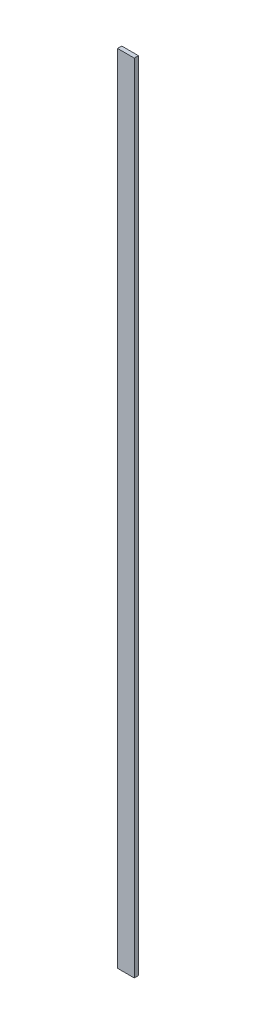
ISO-10303-21;
HEADER;
FILE_DESCRIPTION(('STEP AP214'),'2;1');
FILE_NAME('part.step','',(''),(''),'','','');
FILE_SCHEMA(('AUTOMOTIVE_DESIGN { 1 0 10303 214 1 1 1 1 }'));
ENDSEC;
DATA;
#1=APPLICATION_CONTEXT('core data for automotive mechanical design processes');
#2=APPLICATION_PROTOCOL_DEFINITION('international standard','automotive_design',2000,#1);
#3=PRODUCT_CONTEXT('',#1,'mechanical');
#4=PRODUCT('Part','Part','',(#3));
#5=PRODUCT_RELATED_PRODUCT_CATEGORY('part','',(#4));
#6=PRODUCT_DEFINITION_FORMATION('','',#4);
#7=PRODUCT_DEFINITION_CONTEXT('part definition',#1,'design');
#8=PRODUCT_DEFINITION('design','',#6,#7);
#9=PRODUCT_DEFINITION_SHAPE('','',#8);
#10=(LENGTH_UNIT() NAMED_UNIT(*) SI_UNIT(.MILLI.,.METRE.));
#11=(NAMED_UNIT(*) PLANE_ANGLE_UNIT() SI_UNIT($,.RADIAN.));
#12=(NAMED_UNIT(*) SI_UNIT($,.STERADIAN.) SOLID_ANGLE_UNIT());
#13=UNCERTAINTY_MEASURE_WITH_UNIT(LENGTH_MEASURE(1.E-05),#10,'distance_accuracy_value','');
#14=(GEOMETRIC_REPRESENTATION_CONTEXT(3) GLOBAL_UNCERTAINTY_ASSIGNED_CONTEXT((#13)) GLOBAL_UNIT_ASSIGNED_CONTEXT((#10,
#11,#12)) REPRESENTATION_CONTEXT('',''));
#15=CARTESIAN_POINT('',(0.,0.,0.));
#16=DIRECTION('',(0.,0.,1.));
#17=DIRECTION('',(1.,0.,0.));
#18=AXIS2_PLACEMENT_3D('',#15,#16,#17);
#19=CARTESIAN_POINT('',(-34.5197949308794,-88.3501766624369,1.5875));
#20=DIRECTION('',(1.,0.,0.));
#21=DIRECTION('',(0.,1.,0.));
#22=AXIS2_PLACEMENT_3D('',#19,#20,#21);
#23=PLANE('',#22);
#24=DIRECTION('',(0.,-1.,0.));
#25=VECTOR('',#24,1.);
#26=CARTESIAN_POINT('',(-34.5197949308794,-88.3501766624369,0.));
#27=LINE('',#26,#25);
#28=CARTESIAN_POINT('',(-34.5197949308794,213.914230256237,0.));
#29=VERTEX_POINT('',#28);
#30=CARTESIAN_POINT('',(-34.5197949308794,-88.3501766624369,0.));
#31=VERTEX_POINT('',#30);
#32=EDGE_CURVE('E95',#29,#31,#27,.T.);
#33=ORIENTED_EDGE('',*,*,#32,.T.);
#34=DIRECTION('',(0.,0.,-1.));
#35=VECTOR('',#34,1.);
#36=CARTESIAN_POINT('',(-34.5197949308794,-88.3501766624369,1.5875));
#37=LINE('',#36,#35);
#38=CARTESIAN_POINT('',(-34.5197949308794,-88.3501766624369,1.5875));
#39=VERTEX_POINT('',#38);
#40=EDGE_CURVE('E11',#39,#31,#37,.T.);
#41=ORIENTED_EDGE('',*,*,#40,.F.);
#42=DIRECTION('',(0.,-1.,0.));
#43=VECTOR('',#42,1.);
#44=CARTESIAN_POINT('',(-34.5197949308794,-88.3501766624369,1.5875));
#45=LINE('',#44,#43);
#46=CARTESIAN_POINT('',(-34.5197949308794,213.914230256237,1.5875));
#47=VERTEX_POINT('',#46);
#48=EDGE_CURVE('E83',#47,#39,#45,.T.);
#49=ORIENTED_EDGE('',*,*,#48,.F.);
#50=DIRECTION('',(0.,0.,-1.));
#51=VECTOR('',#50,1.);
#52=CARTESIAN_POINT('',(-34.5197949308794,213.914230256237,1.5875));
#53=LINE('',#52,#51);
#54=EDGE_CURVE('E91',#47,#29,#53,.T.);
#55=ORIENTED_EDGE('',*,*,#54,.T.);
#56=EDGE_LOOP('',(#33,#41,#49,#55));
#57=FACE_BOUND('',#56,.T.);
#58=ADVANCED_FACE('F32',(#57),#23,.F.);
#59=CARTESIAN_POINT('',(-34.5197949308794,-88.3501766624369,1.5875));
#60=DIRECTION('',(0.,1.,0.));
#61=DIRECTION('',(0.,0.,1.));
#62=AXIS2_PLACEMENT_3D('',#59,#60,#61);
#63=PLANE('',#62);
#64=DIRECTION('',(1.,0.,0.));
#65=VECTOR('',#64,1.);
#66=CARTESIAN_POINT('',(-34.5197949308794,-88.3501766624369,0.));
#67=LINE('',#66,#65);
#68=CARTESIAN_POINT('',(-28.1697949308794,-88.3501766624369,0.));
#69=VERTEX_POINT('',#68);
#70=EDGE_CURVE('E87',#31,#69,#67,.T.);
#71=ORIENTED_EDGE('',*,*,#70,.T.);
#72=DIRECTION('',(0.,0.,-1.));
#73=VECTOR('',#72,1.);
#74=CARTESIAN_POINT('',(-28.1697949308794,-88.3501766624369,1.5875));
#75=LINE('',#74,#73);
#76=CARTESIAN_POINT('',(-28.1697949308794,-88.3501766624369,1.5875));
#77=VERTEX_POINT('',#76);
#78=EDGE_CURVE('E40',#77,#69,#75,.T.);
#79=ORIENTED_EDGE('',*,*,#78,.F.);
#80=DIRECTION('',(1.,0.,0.));
#81=VECTOR('',#80,1.);
#82=CARTESIAN_POINT('',(-34.5197949308794,-88.3501766624369,1.5875));
#83=LINE('',#82,#81);
#84=EDGE_CURVE('E78',#39,#77,#83,.T.);
#85=ORIENTED_EDGE('',*,*,#84,.F.);
#86=ORIENTED_EDGE('',*,*,#40,.T.);
#87=EDGE_LOOP('',(#71,#79,#85,#86));
#88=FACE_BOUND('',#87,.T.);
#89=ADVANCED_FACE('F86',(#88),#63,.F.);
#90=CARTESIAN_POINT('',(-28.1697949308794,213.914230256237,1.5875));
#91=DIRECTION('',(-1.,0.,0.));
#92=DIRECTION('',(0.,-1.,0.));
#93=AXIS2_PLACEMENT_3D('',#90,#91,#92);
#94=PLANE('',#93);
#95=DIRECTION('',(0.,1.,0.));
#96=VECTOR('',#95,1.);
#97=CARTESIAN_POINT('',(-28.1697949308794,213.914230256237,0.));
#98=LINE('',#97,#96);
#99=CARTESIAN_POINT('',(-28.1697949308794,213.914230256237,0.));
#100=VERTEX_POINT('',#99);
#101=EDGE_CURVE('E65',#69,#100,#98,.T.);
#102=ORIENTED_EDGE('',*,*,#101,.T.);
#103=DIRECTION('',(0.,0.,-1.));
#104=VECTOR('',#103,1.);
#105=CARTESIAN_POINT('',(-28.1697949308794,213.914230256237,1.5875));
#106=LINE('',#105,#104);
#107=CARTESIAN_POINT('',(-28.1697949308794,213.914230256237,1.5875));
#108=VERTEX_POINT('',#107);
#109=EDGE_CURVE('E88',#108,#100,#106,.T.);
#110=ORIENTED_EDGE('',*,*,#109,.F.);
#111=DIRECTION('',(0.,1.,0.));
#112=VECTOR('',#111,1.);
#113=CARTESIAN_POINT('',(-28.1697949308794,213.914230256237,1.5875));
#114=LINE('',#113,#112);
#115=EDGE_CURVE('E81',#77,#108,#114,.T.);
#116=ORIENTED_EDGE('',*,*,#115,.F.);
#117=ORIENTED_EDGE('',*,*,#78,.T.);
#118=EDGE_LOOP('',(#102,#110,#116,#117));
#119=FACE_BOUND('',#118,.T.);
#120=ADVANCED_FACE('F89',(#119),#94,.F.);
#121=CARTESIAN_POINT('',(-34.5197949308794,213.914230256237,1.5875));
#122=DIRECTION('',(0.,-1.,0.));
#123=DIRECTION('',(0.,0.,-1.));
#124=AXIS2_PLACEMENT_3D('',#121,#122,#123);
#125=PLANE('',#124);
#126=DIRECTION('',(-1.,0.,0.));
#127=VECTOR('',#126,1.);
#128=CARTESIAN_POINT('',(-34.5197949308794,213.914230256237,0.));
#129=LINE('',#128,#127);
#130=EDGE_CURVE('E71',#100,#29,#129,.T.);
#131=ORIENTED_EDGE('',*,*,#130,.T.);
#132=ORIENTED_EDGE('',*,*,#54,.F.);
#133=DIRECTION('',(-1.,0.,0.));
#134=VECTOR('',#133,1.);
#135=CARTESIAN_POINT('',(-34.5197949308794,213.914230256237,1.5875));
#136=LINE('',#135,#134);
#137=EDGE_CURVE('E48',#108,#47,#136,.T.);
#138=ORIENTED_EDGE('',*,*,#137,.F.);
#139=ORIENTED_EDGE('',*,*,#109,.T.);
#140=EDGE_LOOP('',(#131,#132,#138,#139));
#141=FACE_BOUND('',#140,.T.);
#142=ADVANCED_FACE('F102',(#141),#125,.F.);
#143=CARTESIAN_POINT('',(0.,0.,1.5875));
#144=DIRECTION('',(0.,0.,-1.));
#145=DIRECTION('',(-1.,0.,0.));
#146=AXIS2_PLACEMENT_3D('',#143,#144,#145);
#147=PLANE('',#146);
#148=ORIENTED_EDGE('',*,*,#48,.T.);
#149=ORIENTED_EDGE('',*,*,#84,.T.);
#150=ORIENTED_EDGE('',*,*,#115,.T.);
#151=ORIENTED_EDGE('',*,*,#137,.T.);
#152=EDGE_LOOP('',(#148,#149,#150,#151));
#153=FACE_BOUND('',#152,.T.);
#154=ADVANCED_FACE('F79',(#153),#147,.F.);
#155=CARTESIAN_POINT('',(0.,0.,0.));
#156=DIRECTION('',(0.,0.,-1.));
#157=DIRECTION('',(-1.,0.,0.));
#158=AXIS2_PLACEMENT_3D('',#155,#156,#157);
#159=PLANE('',#158);
#160=ORIENTED_EDGE('',*,*,#32,.F.);
#161=ORIENTED_EDGE('',*,*,#130,.F.);
#162=ORIENTED_EDGE('',*,*,#101,.F.);
#163=ORIENTED_EDGE('',*,*,#70,.F.);
#164=EDGE_LOOP('',(#160,#161,#162,#163));
#165=FACE_BOUND('',#164,.T.);
#166=ADVANCED_FACE('F105',(#165),#159,.T.);
#167=CLOSED_SHELL('',(#58,#89,#120,#142,#154,#166));
#168=MANIFOLD_SOLID_BREP('B2',#167);
#169=ADVANCED_BREP_SHAPE_REPRESENTATION('',(#18,#168),#14);
#170=SHAPE_DEFINITION_REPRESENTATION(#9,#169);
ENDSEC;
END-ISO-10303-21;
